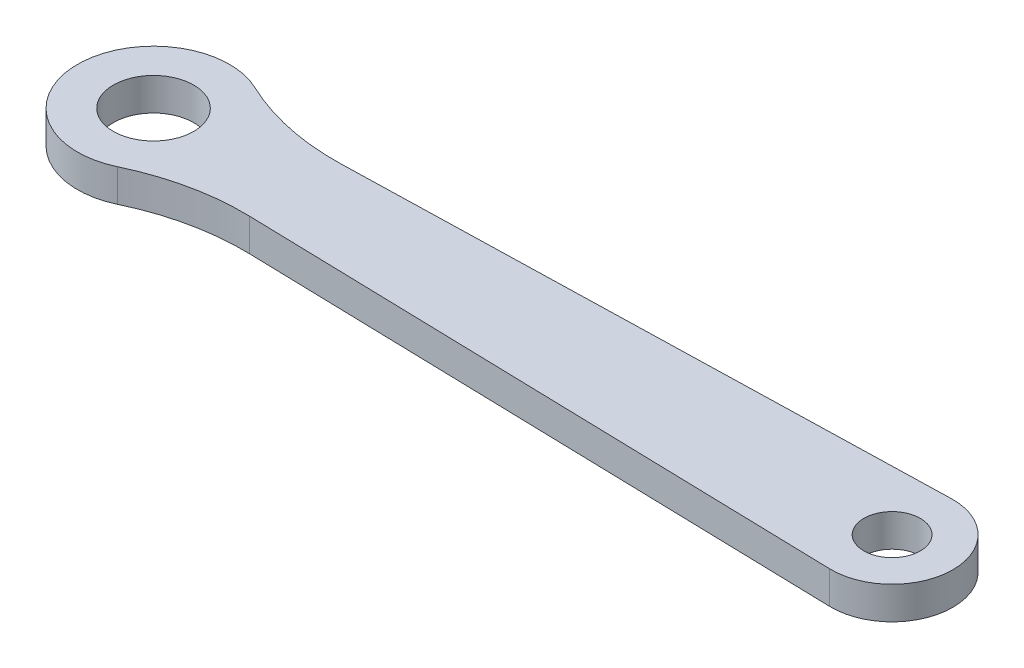
ISO-10303-21;
HEADER;
FILE_DESCRIPTION(('STEP AP214'),'2;1');
FILE_NAME('part.step','',(''),(''),'','','');
FILE_SCHEMA(('AUTOMOTIVE_DESIGN { 1 0 10303 214 1 1 1 1 }'));
ENDSEC;
DATA;
#1=APPLICATION_CONTEXT('core data for automotive mechanical design processes');
#2=APPLICATION_PROTOCOL_DEFINITION('international standard','automotive_design',2000,#1);
#3=PRODUCT_CONTEXT('',#1,'mechanical');
#4=PRODUCT('Part','Part','',(#3));
#5=PRODUCT_RELATED_PRODUCT_CATEGORY('part','',(#4));
#6=PRODUCT_DEFINITION_FORMATION('','',#4);
#7=PRODUCT_DEFINITION_CONTEXT('part definition',#1,'design');
#8=PRODUCT_DEFINITION('design','',#6,#7);
#9=PRODUCT_DEFINITION_SHAPE('','',#8);
#10=(LENGTH_UNIT() NAMED_UNIT(*) SI_UNIT(.MILLI.,.METRE.));
#11=(NAMED_UNIT(*) PLANE_ANGLE_UNIT() SI_UNIT($,.RADIAN.));
#12=(NAMED_UNIT(*) SI_UNIT($,.STERADIAN.) SOLID_ANGLE_UNIT());
#13=UNCERTAINTY_MEASURE_WITH_UNIT(LENGTH_MEASURE(1.E-05),#10,'distance_accuracy_value','');
#14=(GEOMETRIC_REPRESENTATION_CONTEXT(3) GLOBAL_UNCERTAINTY_ASSIGNED_CONTEXT((#13)) GLOBAL_UNIT_ASSIGNED_CONTEXT((#10,
#11,#12)) REPRESENTATION_CONTEXT('',''));
#15=CARTESIAN_POINT('',(0.,0.,0.));
#16=DIRECTION('',(0.,0.,1.));
#17=DIRECTION('',(1.,0.,0.));
#18=AXIS2_PLACEMENT_3D('',#15,#16,#17);
#19=CARTESIAN_POINT('',(340.,15.,0.));
#20=DIRECTION('',(0.,-1.,0.));
#21=DIRECTION('',(0.,0.,-1.));
#22=AXIS2_PLACEMENT_3D('',#19,#20,#21);
#23=PLANE('',#22);
#24=CARTESIAN_POINT('',(340.,15.,0.));
#25=DIRECTION('',(0.,1.,0.));
#26=DIRECTION('',(0.,0.,-1.));
#27=AXIS2_PLACEMENT_3D('',#24,#25,#26);
#28=CIRCLE('',#27,28.);
#29=CARTESIAN_POINT('',(339.279788909642,15.,27.9907358957446));
#30=VERTEX_POINT('',#29);
#31=CARTESIAN_POINT('',(339.279788909642,15.,-27.9907358957446));
#32=VERTEX_POINT('',#31);
#33=EDGE_CURVE('E131',#30,#32,#28,.T.);
#34=ORIENTED_EDGE('',*,*,#33,.T.);
#35=DIRECTION('',(-0.999669139133736,0.,0.0257218246556259));
#36=VECTOR('',#35,1.);
#37=CARTESIAN_POINT('',(65.1964156880508,15.,-20.9384781125971));
#38=LINE('',#37,#36);
#39=CARTESIAN_POINT('',(65.1964156880508,15.,-20.9384781125971));
#40=VERTEX_POINT('',#39);
#41=EDGE_CURVE('E89',#32,#40,#38,.T.);
#42=ORIENTED_EDGE('',*,*,#41,.T.);
#43=CARTESIAN_POINT('',(62.3670149759319,15.,-130.902083417308));
#44=DIRECTION('',(0.,-1.,0.));
#45=DIRECTION('',(0.,0.,1.));
#46=AXIS2_PLACEMENT_3D('',#43,#44,#45);
#47=CIRCLE('',#46,110.);
#48=CARTESIAN_POINT('',(15.0541070631559,15.,-31.5970546179709));
#49=VERTEX_POINT('',#48);
#50=EDGE_CURVE('E102',#40,#49,#47,.T.);
#51=ORIENTED_EDGE('',*,*,#50,.T.);
#52=CARTESIAN_POINT('',(0.,15.,2.42861286636753E-13));
#53=DIRECTION('',(0.,1.,0.));
#54=DIRECTION('',(0.,0.,1.));
#55=AXIS2_PLACEMENT_3D('',#52,#53,#54);
#56=CIRCLE('',#55,35.);
#57=CARTESIAN_POINT('',(15.0541070631561,15.,31.5970546179711));
#58=VERTEX_POINT('',#57);
#59=EDGE_CURVE('E96',#49,#58,#56,.T.);
#60=ORIENTED_EDGE('',*,*,#59,.T.);
#61=CARTESIAN_POINT('',(62.3670149759319,15.,130.902083417308));
#62=DIRECTION('',(0.,-1.,0.));
#63=DIRECTION('',(0.,0.,-1.));
#64=AXIS2_PLACEMENT_3D('',#61,#62,#63);
#65=CIRCLE('',#64,110.);
#66=CARTESIAN_POINT('',(65.1964156880508,15.,20.9384781125971));
#67=VERTEX_POINT('',#66);
#68=EDGE_CURVE('E100',#58,#67,#65,.T.);
#69=ORIENTED_EDGE('',*,*,#68,.T.);
#70=DIRECTION('',(0.999669139133736,0.,0.0257218246556259));
#71=VECTOR('',#70,1.);
#72=CARTESIAN_POINT('',(65.1964156880508,15.,20.9384781125971));
#73=LINE('',#72,#71);
#74=EDGE_CURVE('E52',#67,#30,#73,.T.);
#75=ORIENTED_EDGE('',*,*,#74,.T.);
#76=EDGE_LOOP('',(#34,#42,#51,#60,#69,#75));
#77=FACE_BOUND('',#76,.T.);
#78=CARTESIAN_POINT('',(0.,15.,0.));
#79=DIRECTION('',(0.,1.,0.));
#80=DIRECTION('',(0.,0.,1.));
#81=AXIS2_PLACEMENT_3D('',#78,#79,#80);
#82=CIRCLE('',#81,18.5);
#83=CARTESIAN_POINT('',(0.,15.,18.5));
#84=VERTEX_POINT('',#83);
#85=EDGE_CURVE('E124',#84,#84,#82,.T.);
#86=ORIENTED_EDGE('',*,*,#85,.F.);
#87=EDGE_LOOP('',(#86));
#88=FACE_BOUND('',#87,.T.);
#89=CARTESIAN_POINT('',(340.,15.,0.));
#90=DIRECTION('',(0.,1.,0.));
#91=DIRECTION('',(0.,0.,1.));
#92=AXIS2_PLACEMENT_3D('',#89,#90,#91);
#93=CIRCLE('',#92,13.);
#94=CARTESIAN_POINT('',(340.,15.,13.));
#95=VERTEX_POINT('',#94);
#96=EDGE_CURVE('E172',#95,#95,#93,.T.);
#97=ORIENTED_EDGE('',*,*,#96,.F.);
#98=EDGE_LOOP('',(#97));
#99=FACE_BOUND('',#98,.T.);
#100=ADVANCED_FACE('F35',(#77,#88,#99),#23,.F.);
#101=CARTESIAN_POINT('',(340.,0.,0.));
#102=DIRECTION('',(0.,-1.,0.));
#103=DIRECTION('',(0.,0.,-1.));
#104=AXIS2_PLACEMENT_3D('',#101,#102,#103);
#105=PLANE('',#104);
#106=CARTESIAN_POINT('',(0.,0.,0.));
#107=DIRECTION('',(0.,1.,0.));
#108=DIRECTION('',(0.,0.,1.));
#109=AXIS2_PLACEMENT_3D('',#106,#107,#108);
#110=CIRCLE('',#109,18.5);
#111=CARTESIAN_POINT('',(0.,0.,18.5));
#112=VERTEX_POINT('',#111);
#113=EDGE_CURVE('E177',#112,#112,#110,.T.);
#114=ORIENTED_EDGE('',*,*,#113,.T.);
#115=EDGE_LOOP('',(#114));
#116=FACE_BOUND('',#115,.T.);
#117=CARTESIAN_POINT('',(340.,0.,0.));
#118=DIRECTION('',(0.,1.,0.));
#119=DIRECTION('',(0.,0.,-1.));
#120=AXIS2_PLACEMENT_3D('',#117,#118,#119);
#121=CIRCLE('',#120,28.);
#122=CARTESIAN_POINT('',(339.279788909642,0.,27.9907358957446));
#123=VERTEX_POINT('',#122);
#124=CARTESIAN_POINT('',(339.279788909642,0.,-27.9907358957446));
#125=VERTEX_POINT('',#124);
#126=EDGE_CURVE('E120',#123,#125,#121,.T.);
#127=ORIENTED_EDGE('',*,*,#126,.F.);
#128=DIRECTION('',(0.999669139133736,0.,0.0257218246556259));
#129=VECTOR('',#128,1.);
#130=CARTESIAN_POINT('',(65.1964156880508,0.,20.9384781125971));
#131=LINE('',#130,#129);
#132=CARTESIAN_POINT('',(65.1964156880508,0.,20.9384781125971));
#133=VERTEX_POINT('',#132);
#134=EDGE_CURVE('E81',#133,#123,#131,.T.);
#135=ORIENTED_EDGE('',*,*,#134,.F.);
#136=CARTESIAN_POINT('',(62.3670149759319,0.,130.902083417308));
#137=DIRECTION('',(0.,-1.,0.));
#138=DIRECTION('',(0.,0.,-1.));
#139=AXIS2_PLACEMENT_3D('',#136,#137,#138);
#140=CIRCLE('',#139,110.);
#141=CARTESIAN_POINT('',(15.0541070631561,0.,31.5970546179711));
#142=VERTEX_POINT('',#141);
#143=EDGE_CURVE('E75',#142,#133,#140,.T.);
#144=ORIENTED_EDGE('',*,*,#143,.F.);
#145=CARTESIAN_POINT('',(0.,0.,2.42861286636753E-13));
#146=DIRECTION('',(0.,1.,0.));
#147=DIRECTION('',(0.,0.,1.));
#148=AXIS2_PLACEMENT_3D('',#145,#146,#147);
#149=CIRCLE('',#148,35.);
#150=CARTESIAN_POINT('',(15.0541070631559,0.,-31.5970546179709));
#151=VERTEX_POINT('',#150);
#152=EDGE_CURVE('E110',#151,#142,#149,.T.);
#153=ORIENTED_EDGE('',*,*,#152,.F.);
#154=CARTESIAN_POINT('',(62.3670149759319,0.,-130.902083417308));
#155=DIRECTION('',(0.,-1.,0.));
#156=DIRECTION('',(0.,0.,1.));
#157=AXIS2_PLACEMENT_3D('',#154,#155,#156);
#158=CIRCLE('',#157,110.);
#159=CARTESIAN_POINT('',(65.1964156880508,0.,-20.9384781125971));
#160=VERTEX_POINT('',#159);
#161=EDGE_CURVE('E126',#160,#151,#158,.T.);
#162=ORIENTED_EDGE('',*,*,#161,.F.);
#163=DIRECTION('',(-0.999669139133736,0.,0.0257218246556259));
#164=VECTOR('',#163,1.);
#165=CARTESIAN_POINT('',(65.1964156880508,0.,-20.9384781125971));
#166=LINE('',#165,#164);
#167=EDGE_CURVE('E123',#125,#160,#166,.T.);
#168=ORIENTED_EDGE('',*,*,#167,.F.);
#169=EDGE_LOOP('',(#127,#135,#144,#153,#162,#168));
#170=FACE_BOUND('',#169,.T.);
#171=CARTESIAN_POINT('',(340.,0.,0.));
#172=DIRECTION('',(0.,1.,0.));
#173=DIRECTION('',(0.,0.,1.));
#174=AXIS2_PLACEMENT_3D('',#171,#172,#173);
#175=CIRCLE('',#174,13.);
#176=CARTESIAN_POINT('',(340.,0.,13.));
#177=VERTEX_POINT('',#176);
#178=EDGE_CURVE('E175',#177,#177,#175,.T.);
#179=ORIENTED_EDGE('',*,*,#178,.T.);
#180=EDGE_LOOP('',(#179));
#181=FACE_BOUND('',#180,.T.);
#182=ADVANCED_FACE('F140',(#116,#170,#181),#105,.T.);
#183=CARTESIAN_POINT('',(340.,15.,0.));
#184=DIRECTION('',(0.,-1.,0.));
#185=DIRECTION('',(0.,0.,-1.));
#186=AXIS2_PLACEMENT_3D('',#183,#184,#185);
#187=CYLINDRICAL_SURFACE('',#186,28.);
#188=ORIENTED_EDGE('',*,*,#126,.T.);
#189=DIRECTION('',(0.,-1.,0.));
#190=VECTOR('',#189,1.);
#191=CARTESIAN_POINT('',(339.279788909642,15.,-27.9907358957446));
#192=LINE('',#191,#190);
#193=EDGE_CURVE('E11',#32,#125,#192,.T.);
#194=ORIENTED_EDGE('',*,*,#193,.F.);
#195=ORIENTED_EDGE('',*,*,#33,.F.);
#196=DIRECTION('',(0.,-1.,0.));
#197=VECTOR('',#196,1.);
#198=CARTESIAN_POINT('',(339.279788909642,15.,27.9907358957446));
#199=LINE('',#198,#197);
#200=EDGE_CURVE('E116',#30,#123,#199,.T.);
#201=ORIENTED_EDGE('',*,*,#200,.T.);
#202=EDGE_LOOP('',(#188,#194,#195,#201));
#203=FACE_BOUND('',#202,.T.);
#204=ADVANCED_FACE('F37',(#203),#187,.T.);
#205=CARTESIAN_POINT('',(65.1964156880508,15.,-20.9384781125971));
#206=DIRECTION('',(0.0257218246556259,0.,0.999669139133736));
#207=DIRECTION('',(0.999669139133736,0.,-0.0257218246556259));
#208=AXIS2_PLACEMENT_3D('',#205,#206,#207);
#209=PLANE('',#208);
#210=ORIENTED_EDGE('',*,*,#167,.T.);
#211=DIRECTION('',(0.,-1.,0.));
#212=VECTOR('',#211,1.);
#213=CARTESIAN_POINT('',(65.1964156880508,15.,-20.9384781125971));
#214=LINE('',#213,#212);
#215=EDGE_CURVE('E44',#40,#160,#214,.T.);
#216=ORIENTED_EDGE('',*,*,#215,.F.);
#217=ORIENTED_EDGE('',*,*,#41,.F.);
#218=ORIENTED_EDGE('',*,*,#193,.T.);
#219=EDGE_LOOP('',(#210,#216,#217,#218));
#220=FACE_BOUND('',#219,.T.);
#221=ADVANCED_FACE('F220',(#220),#209,.F.);
#222=CARTESIAN_POINT('',(62.3670149759319,15.,-130.902083417308));
#223=DIRECTION('',(0.,-1.,0.));
#224=DIRECTION('',(0.,0.,-1.));
#225=AXIS2_PLACEMENT_3D('',#222,#223,#224);
#226=CYLINDRICAL_SURFACE('',#225,110.);
#227=ORIENTED_EDGE('',*,*,#161,.T.);
#228=DIRECTION('',(0.,-1.,0.));
#229=VECTOR('',#228,1.);
#230=CARTESIAN_POINT('',(15.0541070631559,15.,-31.5970546179709));
#231=LINE('',#230,#229);
#232=EDGE_CURVE('E111',#49,#151,#231,.T.);
#233=ORIENTED_EDGE('',*,*,#232,.F.);
#234=ORIENTED_EDGE('',*,*,#50,.F.);
#235=ORIENTED_EDGE('',*,*,#215,.T.);
#236=EDGE_LOOP('',(#227,#233,#234,#235));
#237=FACE_BOUND('',#236,.T.);
#238=ADVANCED_FACE('F137',(#237),#226,.F.);
#239=CARTESIAN_POINT('',(0.,15.,2.42861286636753E-13));
#240=DIRECTION('',(0.,-1.,0.));
#241=DIRECTION('',(0.,0.,-1.));
#242=AXIS2_PLACEMENT_3D('',#239,#240,#241);
#243=CYLINDRICAL_SURFACE('',#242,35.);
#244=ORIENTED_EDGE('',*,*,#152,.T.);
#245=DIRECTION('',(0.,-1.,0.));
#246=VECTOR('',#245,1.);
#247=CARTESIAN_POINT('',(15.0541070631561,15.,31.5970546179711));
#248=LINE('',#247,#246);
#249=EDGE_CURVE('E107',#58,#142,#248,.T.);
#250=ORIENTED_EDGE('',*,*,#249,.F.);
#251=ORIENTED_EDGE('',*,*,#59,.F.);
#252=ORIENTED_EDGE('',*,*,#232,.T.);
#253=EDGE_LOOP('',(#244,#250,#251,#252));
#254=FACE_BOUND('',#253,.T.);
#255=ADVANCED_FACE('F108',(#254),#243,.T.);
#256=CARTESIAN_POINT('',(62.3670149759319,15.,130.902083417308));
#257=DIRECTION('',(0.,-1.,0.));
#258=DIRECTION('',(0.,0.,-1.));
#259=AXIS2_PLACEMENT_3D('',#256,#257,#258);
#260=CYLINDRICAL_SURFACE('',#259,110.);
#261=ORIENTED_EDGE('',*,*,#143,.T.);
#262=DIRECTION('',(0.,-1.,0.));
#263=VECTOR('',#262,1.);
#264=CARTESIAN_POINT('',(65.1964156880508,15.,20.9384781125971));
#265=LINE('',#264,#263);
#266=EDGE_CURVE('E112',#67,#133,#265,.T.);
#267=ORIENTED_EDGE('',*,*,#266,.F.);
#268=ORIENTED_EDGE('',*,*,#68,.F.);
#269=ORIENTED_EDGE('',*,*,#249,.T.);
#270=EDGE_LOOP('',(#261,#267,#268,#269));
#271=FACE_BOUND('',#270,.T.);
#272=ADVANCED_FACE('F114',(#271),#260,.F.);
#273=CARTESIAN_POINT('',(65.1964156880508,15.,20.9384781125971));
#274=DIRECTION('',(0.0257218246556259,0.,-0.999669139133736));
#275=DIRECTION('',(-0.999669139133736,0.,-0.0257218246556259));
#276=AXIS2_PLACEMENT_3D('',#273,#274,#275);
#277=PLANE('',#276);
#278=ORIENTED_EDGE('',*,*,#134,.T.);
#279=ORIENTED_EDGE('',*,*,#200,.F.);
#280=ORIENTED_EDGE('',*,*,#74,.F.);
#281=ORIENTED_EDGE('',*,*,#266,.T.);
#282=EDGE_LOOP('',(#278,#279,#280,#281));
#283=FACE_BOUND('',#282,.T.);
#284=ADVANCED_FACE('F145',(#283),#277,.F.);
#285=CARTESIAN_POINT('',(0.,15.,0.));
#286=DIRECTION('',(0.,-1.,0.));
#287=DIRECTION('',(0.,0.,-1.));
#288=AXIS2_PLACEMENT_3D('',#285,#286,#287);
#289=CYLINDRICAL_SURFACE('',#288,18.5);
#290=ORIENTED_EDGE('',*,*,#85,.T.);
#291=EDGE_LOOP('',(#290));
#292=FACE_BOUND('',#291,.T.);
#293=ORIENTED_EDGE('',*,*,#113,.F.);
#294=EDGE_LOOP('',(#293));
#295=FACE_BOUND('',#294,.T.);
#296=ADVANCED_FACE('F147',(#292,#295),#289,.F.);
#297=CARTESIAN_POINT('',(340.,15.,0.));
#298=DIRECTION('',(0.,-1.,0.));
#299=DIRECTION('',(0.,0.,-1.));
#300=AXIS2_PLACEMENT_3D('',#297,#298,#299);
#301=CYLINDRICAL_SURFACE('',#300,13.);
#302=ORIENTED_EDGE('',*,*,#96,.T.);
#303=EDGE_LOOP('',(#302));
#304=FACE_BOUND('',#303,.T.);
#305=ORIENTED_EDGE('',*,*,#178,.F.);
#306=EDGE_LOOP('',(#305));
#307=FACE_BOUND('',#306,.T.);
#308=ADVANCED_FACE('F153',(#304,#307),#301,.F.);
#309=CLOSED_SHELL('',(#100,#182,#204,#221,#238,#255,#272,#284,#296,#308));
#310=MANIFOLD_SOLID_BREP('B2',#309);
#311=ADVANCED_BREP_SHAPE_REPRESENTATION('',(#18,#310),#14);
#312=SHAPE_DEFINITION_REPRESENTATION(#9,#311);
ENDSEC;
END-ISO-10303-21;
